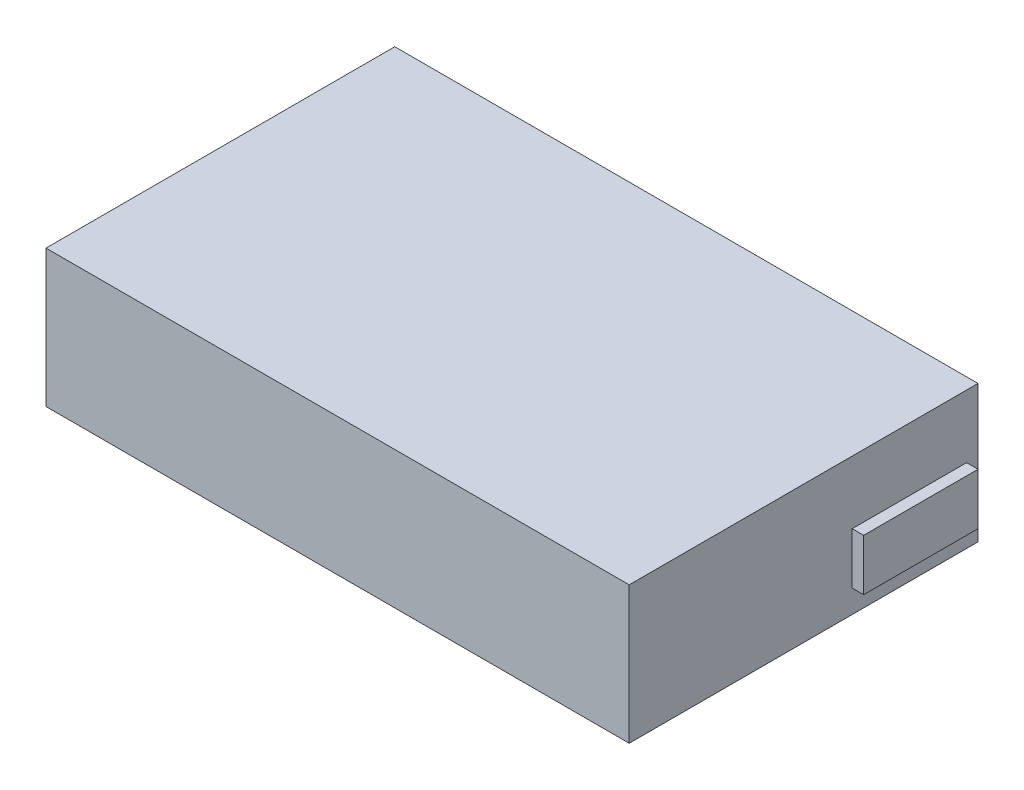
ISO-10303-21;
HEADER;
FILE_DESCRIPTION(('STEP AP214'),'2;1');
FILE_NAME('part.step','',(''),(''),'','','');
FILE_SCHEMA(('AUTOMOTIVE_DESIGN { 1 0 10303 214 1 1 1 1 }'));
ENDSEC;
DATA;
#1=APPLICATION_CONTEXT('core data for automotive mechanical design processes');
#2=APPLICATION_PROTOCOL_DEFINITION('international standard','automotive_design',2000,#1);
#3=PRODUCT_CONTEXT('',#1,'mechanical');
#4=PRODUCT('Part','Part','',(#3));
#5=PRODUCT_RELATED_PRODUCT_CATEGORY('part','',(#4));
#6=PRODUCT_DEFINITION_FORMATION('','',#4);
#7=PRODUCT_DEFINITION_CONTEXT('part definition',#1,'design');
#8=PRODUCT_DEFINITION('design','',#6,#7);
#9=PRODUCT_DEFINITION_SHAPE('','',#8);
#10=(LENGTH_UNIT() NAMED_UNIT(*) SI_UNIT(.MILLI.,.METRE.));
#11=(NAMED_UNIT(*) PLANE_ANGLE_UNIT() SI_UNIT($,.RADIAN.));
#12=(NAMED_UNIT(*) SI_UNIT($,.STERADIAN.) SOLID_ANGLE_UNIT());
#13=UNCERTAINTY_MEASURE_WITH_UNIT(LENGTH_MEASURE(1.E-05),#10,'distance_accuracy_value','');
#14=(GEOMETRIC_REPRESENTATION_CONTEXT(3) GLOBAL_UNCERTAINTY_ASSIGNED_CONTEXT((#13)) GLOBAL_UNIT_ASSIGNED_CONTEXT((#10,
#11,#12)) REPRESENTATION_CONTEXT('',''));
#15=CARTESIAN_POINT('',(0.,0.,0.));
#16=DIRECTION('',(0.,0.,1.));
#17=DIRECTION('',(1.,0.,0.));
#18=AXIS2_PLACEMENT_3D('',#15,#16,#17);
#19=CARTESIAN_POINT('',(51.,24.,30.5));
#20=DIRECTION('',(-1.,0.,0.));
#21=DIRECTION('',(0.,0.,1.));
#22=AXIS2_PLACEMENT_3D('',#19,#20,#21);
#23=PLANE('',#22);
#24=DIRECTION('',(0.,0.,-1.));
#25=VECTOR('',#24,1.);
#26=CARTESIAN_POINT('',(51.,0.,30.5));
#27=LINE('',#26,#25);
#28=CARTESIAN_POINT('',(51.,0.,30.5));
#29=VERTEX_POINT('',#28);
#30=CARTESIAN_POINT('',(51.,0.,-30.5));
#31=VERTEX_POINT('',#30);
#32=EDGE_CURVE('E118',#29,#31,#27,.T.);
#33=ORIENTED_EDGE('',*,*,#32,.T.);
#34=DIRECTION('',(0.,-1.,0.));
#35=VECTOR('',#34,1.);
#36=CARTESIAN_POINT('',(51.,24.,-30.5));
#37=LINE('',#36,#35);
#38=CARTESIAN_POINT('',(51.,24.,-30.5));
#39=VERTEX_POINT('',#38);
#40=EDGE_CURVE('E11',#39,#31,#37,.T.);
#41=ORIENTED_EDGE('',*,*,#40,.F.);
#42=DIRECTION('',(0.,0.,-1.));
#43=VECTOR('',#42,1.);
#44=CARTESIAN_POINT('',(51.,24.,30.5));
#45=LINE('',#44,#43);
#46=CARTESIAN_POINT('',(51.,24.,30.5));
#47=VERTEX_POINT('',#46);
#48=EDGE_CURVE('E127',#47,#39,#45,.T.);
#49=ORIENTED_EDGE('',*,*,#48,.F.);
#50=DIRECTION('',(0.,-1.,0.));
#51=VECTOR('',#50,1.);
#52=CARTESIAN_POINT('',(51.,24.,30.5));
#53=LINE('',#52,#51);
#54=EDGE_CURVE('E136',#47,#29,#53,.T.);
#55=ORIENTED_EDGE('',*,*,#54,.T.);
#56=EDGE_LOOP('',(#33,#41,#49,#55));
#57=FACE_BOUND('',#56,.T.);
#58=DIRECTION('',(0.,-1.,0.));
#59=VECTOR('',#58,1.);
#60=CARTESIAN_POINT('',(51.,13.,-8.5));
#61=LINE('',#60,#59);
#62=CARTESIAN_POINT('',(51.,13.,-8.5));
#63=VERTEX_POINT('',#62);
#64=CARTESIAN_POINT('',(51.,4.,-8.50000000000001));
#65=VERTEX_POINT('',#64);
#66=EDGE_CURVE('E117',#63,#65,#61,.T.);
#67=ORIENTED_EDGE('',*,*,#66,.F.);
#68=DIRECTION('',(0.,0.,1.));
#69=VECTOR('',#68,1.);
#70=CARTESIAN_POINT('',(51.,13.,-8.5));
#71=LINE('',#70,#69);
#72=CARTESIAN_POINT('',(51.,13.,-28.5));
#73=VERTEX_POINT('',#72);
#74=EDGE_CURVE('E114',#73,#63,#71,.T.);
#75=ORIENTED_EDGE('',*,*,#74,.F.);
#76=DIRECTION('',(0.,1.,0.));
#77=VECTOR('',#76,1.);
#78=CARTESIAN_POINT('',(51.,13.,-28.5));
#79=LINE('',#78,#77);
#80=CARTESIAN_POINT('',(51.,4.,-28.5));
#81=VERTEX_POINT('',#80);
#82=EDGE_CURVE('E52',#81,#73,#79,.T.);
#83=ORIENTED_EDGE('',*,*,#82,.F.);
#84=DIRECTION('',(0.,0.,-1.));
#85=VECTOR('',#84,1.);
#86=CARTESIAN_POINT('',(51.,4.,-8.5));
#87=LINE('',#86,#85);
#88=EDGE_CURVE('E47',#65,#81,#87,.T.);
#89=ORIENTED_EDGE('',*,*,#88,.F.);
#90=EDGE_LOOP('',(#67,#75,#83,#89));
#91=FACE_BOUND('',#90,.T.);
#92=ADVANCED_FACE('F33',(#57,#91),#23,.F.);
#93=CARTESIAN_POINT('',(-51.,24.,-30.5));
#94=DIRECTION('',(0.,0.,1.));
#95=DIRECTION('',(1.,0.,0.));
#96=AXIS2_PLACEMENT_3D('',#93,#94,#95);
#97=PLANE('',#96);
#98=DIRECTION('',(-1.,0.,0.));
#99=VECTOR('',#98,1.);
#100=CARTESIAN_POINT('',(-51.,0.,-30.5));
#101=LINE('',#100,#99);
#102=CARTESIAN_POINT('',(-51.,0.,-30.5));
#103=VERTEX_POINT('',#102);
#104=EDGE_CURVE('E121',#31,#103,#101,.T.);
#105=ORIENTED_EDGE('',*,*,#104,.T.);
#106=DIRECTION('',(0.,-1.,0.));
#107=VECTOR('',#106,1.);
#108=CARTESIAN_POINT('',(-51.,24.,-30.5));
#109=LINE('',#108,#107);
#110=CARTESIAN_POINT('',(-51.,24.,-30.5));
#111=VERTEX_POINT('',#110);
#112=EDGE_CURVE('E40',#111,#103,#109,.T.);
#113=ORIENTED_EDGE('',*,*,#112,.F.);
#114=DIRECTION('',(-1.,0.,0.));
#115=VECTOR('',#114,1.);
#116=CARTESIAN_POINT('',(-51.,24.,-30.5));
#117=LINE('',#116,#115);
#118=EDGE_CURVE('E130',#39,#111,#117,.T.);
#119=ORIENTED_EDGE('',*,*,#118,.F.);
#120=ORIENTED_EDGE('',*,*,#40,.T.);
#121=EDGE_LOOP('',(#105,#113,#119,#120));
#122=FACE_BOUND('',#121,.T.);
#123=ADVANCED_FACE('F167',(#122),#97,.F.);
#124=CARTESIAN_POINT('',(-51.,24.,30.5));
#125=DIRECTION('',(1.,0.,0.));
#126=DIRECTION('',(0.,0.,-1.));
#127=AXIS2_PLACEMENT_3D('',#124,#125,#126);
#128=PLANE('',#127);
#129=DIRECTION('',(0.,0.,1.));
#130=VECTOR('',#129,1.);
#131=CARTESIAN_POINT('',(-51.,0.,30.5));
#132=LINE('',#131,#130);
#133=CARTESIAN_POINT('',(-51.,0.,30.5));
#134=VERTEX_POINT('',#133);
#135=EDGE_CURVE('E139',#103,#134,#132,.T.);
#136=ORIENTED_EDGE('',*,*,#135,.T.);
#137=DIRECTION('',(0.,-1.,0.));
#138=VECTOR('',#137,1.);
#139=CARTESIAN_POINT('',(-51.,24.,30.5));
#140=LINE('',#139,#138);
#141=CARTESIAN_POINT('',(-51.,24.,30.5));
#142=VERTEX_POINT('',#141);
#143=EDGE_CURVE('E144',#142,#134,#140,.T.);
#144=ORIENTED_EDGE('',*,*,#143,.F.);
#145=DIRECTION('',(0.,0.,1.));
#146=VECTOR('',#145,1.);
#147=CARTESIAN_POINT('',(-51.,24.,30.5));
#148=LINE('',#147,#146);
#149=EDGE_CURVE('E133',#111,#142,#148,.T.);
#150=ORIENTED_EDGE('',*,*,#149,.F.);
#151=ORIENTED_EDGE('',*,*,#112,.T.);
#152=EDGE_LOOP('',(#136,#144,#150,#151));
#153=FACE_BOUND('',#152,.T.);
#154=ADVANCED_FACE('F151',(#153),#128,.F.);
#155=CARTESIAN_POINT('',(-51.,24.,30.5));
#156=DIRECTION('',(0.,0.,-1.));
#157=DIRECTION('',(-1.,0.,0.));
#158=AXIS2_PLACEMENT_3D('',#155,#156,#157);
#159=PLANE('',#158);
#160=DIRECTION('',(1.,0.,0.));
#161=VECTOR('',#160,1.);
#162=CARTESIAN_POINT('',(-51.,0.,30.5));
#163=LINE('',#162,#161);
#164=EDGE_CURVE('E131',#134,#29,#163,.T.);
#165=ORIENTED_EDGE('',*,*,#164,.T.);
#166=ORIENTED_EDGE('',*,*,#54,.F.);
#167=DIRECTION('',(1.,0.,0.));
#168=VECTOR('',#167,1.);
#169=CARTESIAN_POINT('',(-51.,24.,30.5));
#170=LINE('',#169,#168);
#171=EDGE_CURVE('E135',#142,#47,#170,.T.);
#172=ORIENTED_EDGE('',*,*,#171,.F.);
#173=ORIENTED_EDGE('',*,*,#143,.T.);
#174=EDGE_LOOP('',(#165,#166,#172,#173));
#175=FACE_BOUND('',#174,.T.);
#176=ADVANCED_FACE('F160',(#175),#159,.F.);
#177=CARTESIAN_POINT('',(0.,24.,0.));
#178=DIRECTION('',(0.,-1.,0.));
#179=DIRECTION('',(0.,0.,-1.));
#180=AXIS2_PLACEMENT_3D('',#177,#178,#179);
#181=PLANE('',#180);
#182=ORIENTED_EDGE('',*,*,#48,.T.);
#183=ORIENTED_EDGE('',*,*,#118,.T.);
#184=ORIENTED_EDGE('',*,*,#149,.T.);
#185=ORIENTED_EDGE('',*,*,#171,.T.);
#186=EDGE_LOOP('',(#182,#183,#184,#185));
#187=FACE_BOUND('',#186,.T.);
#188=ADVANCED_FACE('F166',(#187),#181,.F.);
#189=CARTESIAN_POINT('',(0.,0.,0.));
#190=DIRECTION('',(0.,-1.,0.));
#191=DIRECTION('',(0.,0.,-1.));
#192=AXIS2_PLACEMENT_3D('',#189,#190,#191);
#193=PLANE('',#192);
#194=ORIENTED_EDGE('',*,*,#32,.F.);
#195=ORIENTED_EDGE('',*,*,#164,.F.);
#196=ORIENTED_EDGE('',*,*,#135,.F.);
#197=ORIENTED_EDGE('',*,*,#104,.F.);
#198=EDGE_LOOP('',(#194,#195,#196,#197));
#199=FACE_BOUND('',#198,.T.);
#200=ADVANCED_FACE('F157',(#199),#193,.T.);
#201=CARTESIAN_POINT('',(53.,13.,-8.5));
#202=DIRECTION('',(0.,0.,-1.));
#203=DIRECTION('',(0.,1.,0.));
#204=AXIS2_PLACEMENT_3D('',#201,#202,#203);
#205=PLANE('',#204);
#206=ORIENTED_EDGE('',*,*,#66,.T.);
#207=DIRECTION('',(-1.,0.,0.));
#208=VECTOR('',#207,1.);
#209=CARTESIAN_POINT('',(53.,4.,-8.5));
#210=LINE('',#209,#208);
#211=CARTESIAN_POINT('',(53.,4.,-8.5));
#212=VERTEX_POINT('',#211);
#213=EDGE_CURVE('E98',#212,#65,#210,.T.);
#214=ORIENTED_EDGE('',*,*,#213,.F.);
#215=DIRECTION('',(0.,-1.,0.));
#216=VECTOR('',#215,1.);
#217=CARTESIAN_POINT('',(53.,13.,-8.5));
#218=LINE('',#217,#216);
#219=CARTESIAN_POINT('',(53.,13.,-8.5));
#220=VERTEX_POINT('',#219);
#221=EDGE_CURVE('E105',#220,#212,#218,.T.);
#222=ORIENTED_EDGE('',*,*,#221,.F.);
#223=DIRECTION('',(-1.,0.,0.));
#224=VECTOR('',#223,1.);
#225=CARTESIAN_POINT('',(53.,13.,-8.5));
#226=LINE('',#225,#224);
#227=EDGE_CURVE('E260',#220,#63,#226,.T.);
#228=ORIENTED_EDGE('',*,*,#227,.T.);
#229=EDGE_LOOP('',(#206,#214,#222,#228));
#230=FACE_BOUND('',#229,.T.);
#231=ADVANCED_FACE('F116',(#230),#205,.F.);
#232=CARTESIAN_POINT('',(53.,4.,-8.5));
#233=DIRECTION('',(0.,1.,0.));
#234=DIRECTION('',(0.,0.,1.));
#235=AXIS2_PLACEMENT_3D('',#232,#233,#234);
#236=PLANE('',#235);
#237=ORIENTED_EDGE('',*,*,#88,.T.);
#238=DIRECTION('',(-1.,0.,0.));
#239=VECTOR('',#238,1.);
#240=CARTESIAN_POINT('',(53.,4.,-28.5));
#241=LINE('',#240,#239);
#242=CARTESIAN_POINT('',(53.,4.,-28.5));
#243=VERTEX_POINT('',#242);
#244=EDGE_CURVE('E101',#243,#81,#241,.T.);
#245=ORIENTED_EDGE('',*,*,#244,.F.);
#246=DIRECTION('',(0.,0.,-1.));
#247=VECTOR('',#246,1.);
#248=CARTESIAN_POINT('',(53.,4.,-8.5));
#249=LINE('',#248,#247);
#250=EDGE_CURVE('E94',#212,#243,#249,.T.);
#251=ORIENTED_EDGE('',*,*,#250,.F.);
#252=ORIENTED_EDGE('',*,*,#213,.T.);
#253=EDGE_LOOP('',(#237,#245,#251,#252));
#254=FACE_BOUND('',#253,.T.);
#255=ADVANCED_FACE('F96',(#254),#236,.F.);
#256=CARTESIAN_POINT('',(53.,13.,-28.5));
#257=DIRECTION('',(0.,0.,1.));
#258=DIRECTION('',(0.,-1.,0.));
#259=AXIS2_PLACEMENT_3D('',#256,#257,#258);
#260=PLANE('',#259);
#261=ORIENTED_EDGE('',*,*,#82,.T.);
#262=DIRECTION('',(-1.,0.,0.));
#263=VECTOR('',#262,1.);
#264=CARTESIAN_POINT('',(53.,13.,-28.5));
#265=LINE('',#264,#263);
#266=CARTESIAN_POINT('',(53.,13.,-28.5));
#267=VERTEX_POINT('',#266);
#268=EDGE_CURVE('E123',#267,#73,#265,.T.);
#269=ORIENTED_EDGE('',*,*,#268,.F.);
#270=DIRECTION('',(0.,1.,0.));
#271=VECTOR('',#270,1.);
#272=CARTESIAN_POINT('',(53.,13.,-28.5));
#273=LINE('',#272,#271);
#274=EDGE_CURVE('E104',#243,#267,#273,.T.);
#275=ORIENTED_EDGE('',*,*,#274,.F.);
#276=ORIENTED_EDGE('',*,*,#244,.T.);
#277=EDGE_LOOP('',(#261,#269,#275,#276));
#278=FACE_BOUND('',#277,.T.);
#279=ADVANCED_FACE('F185',(#278),#260,.F.);
#280=CARTESIAN_POINT('',(53.,13.,-8.5));
#281=DIRECTION('',(0.,-1.,0.));
#282=DIRECTION('',(0.,0.,-1.));
#283=AXIS2_PLACEMENT_3D('',#280,#281,#282);
#284=PLANE('',#283);
#285=ORIENTED_EDGE('',*,*,#74,.T.);
#286=ORIENTED_EDGE('',*,*,#227,.F.);
#287=DIRECTION('',(0.,0.,1.));
#288=VECTOR('',#287,1.);
#289=CARTESIAN_POINT('',(53.,13.,-8.5));
#290=LINE('',#289,#288);
#291=EDGE_CURVE('E110',#267,#220,#290,.T.);
#292=ORIENTED_EDGE('',*,*,#291,.F.);
#293=ORIENTED_EDGE('',*,*,#268,.T.);
#294=EDGE_LOOP('',(#285,#286,#292,#293));
#295=FACE_BOUND('',#294,.T.);
#296=ADVANCED_FACE('F188',(#295),#284,.F.);
#297=CARTESIAN_POINT('',(53.,0.,0.));
#298=DIRECTION('',(1.,0.,0.));
#299=DIRECTION('',(0.,0.,-1.));
#300=AXIS2_PLACEMENT_3D('',#297,#298,#299);
#301=PLANE('',#300);
#302=ORIENTED_EDGE('',*,*,#221,.T.);
#303=ORIENTED_EDGE('',*,*,#250,.T.);
#304=ORIENTED_EDGE('',*,*,#274,.T.);
#305=ORIENTED_EDGE('',*,*,#291,.T.);
#306=EDGE_LOOP('',(#302,#303,#304,#305));
#307=FACE_BOUND('',#306,.T.);
#308=ADVANCED_FACE('F108',(#307),#301,.T.);
#309=CLOSED_SHELL('',(#92,#123,#154,#176,#188,#200,#231,#255,#279,#296,#308));
#310=MANIFOLD_SOLID_BREP('B2',#309);
#311=ADVANCED_BREP_SHAPE_REPRESENTATION('',(#18,#310),#14);
#312=SHAPE_DEFINITION_REPRESENTATION(#9,#311);
ENDSEC;
END-ISO-10303-21;
